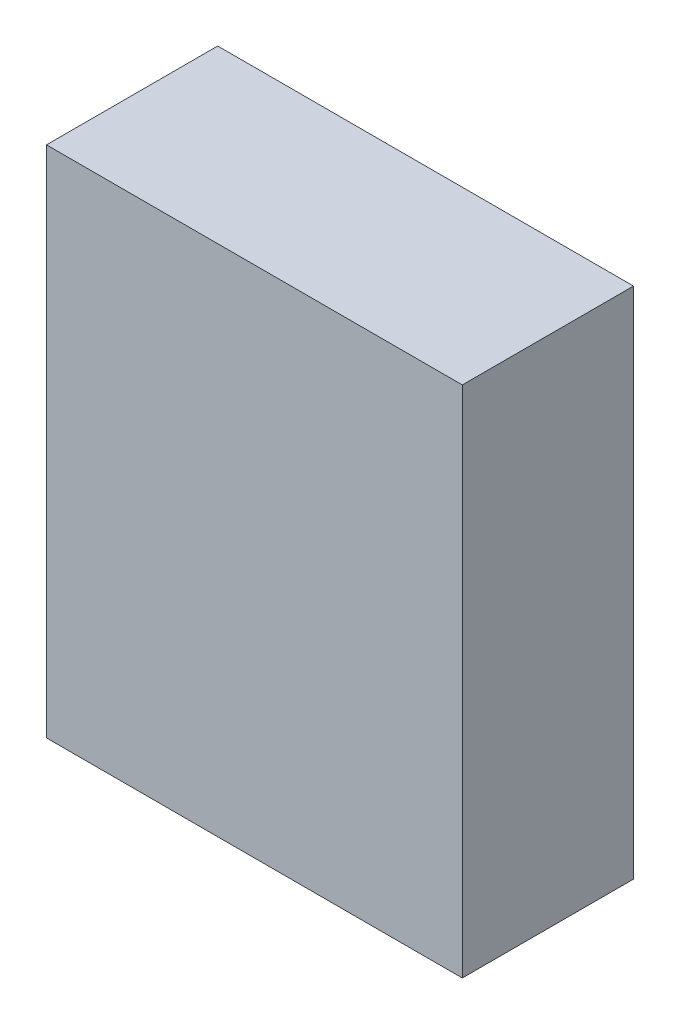
ISO-10303-21;
HEADER;
FILE_DESCRIPTION(('STEP AP214'),'2;1');
FILE_NAME('part.step','',(''),(''),'','','');
FILE_SCHEMA(('AUTOMOTIVE_DESIGN { 1 0 10303 214 1 1 1 1 }'));
ENDSEC;
DATA;
#1=APPLICATION_CONTEXT('core data for automotive mechanical design processes');
#2=APPLICATION_PROTOCOL_DEFINITION('international standard','automotive_design',2000,#1);
#3=PRODUCT_CONTEXT('',#1,'mechanical');
#4=PRODUCT('Part','Part','',(#3));
#5=PRODUCT_RELATED_PRODUCT_CATEGORY('part','',(#4));
#6=PRODUCT_DEFINITION_FORMATION('','',#4);
#7=PRODUCT_DEFINITION_CONTEXT('part definition',#1,'design');
#8=PRODUCT_DEFINITION('design','',#6,#7);
#9=PRODUCT_DEFINITION_SHAPE('','',#8);
#10=(LENGTH_UNIT() NAMED_UNIT(*) SI_UNIT(.MILLI.,.METRE.));
#11=(NAMED_UNIT(*) PLANE_ANGLE_UNIT() SI_UNIT($,.RADIAN.));
#12=(NAMED_UNIT(*) SI_UNIT($,.STERADIAN.) SOLID_ANGLE_UNIT());
#13=UNCERTAINTY_MEASURE_WITH_UNIT(LENGTH_MEASURE(1.E-05),#10,'distance_accuracy_value','');
#14=(GEOMETRIC_REPRESENTATION_CONTEXT(3) GLOBAL_UNCERTAINTY_ASSIGNED_CONTEXT((#13)) GLOBAL_UNIT_ASSIGNED_CONTEXT((#10,
#11,#12)) REPRESENTATION_CONTEXT('',''));
#15=CARTESIAN_POINT('',(0.,0.,0.));
#16=DIRECTION('',(0.,0.,1.));
#17=DIRECTION('',(1.,0.,0.));
#18=AXIS2_PLACEMENT_3D('',#15,#16,#17);
#19=CARTESIAN_POINT('',(22.0610671121381,2.95082692418756,2.82031719400001));
#20=CARTESIAN_POINT('',(22.0610671121381,2.95082692418756,1.98031582600001));
#21=CARTESIAN_POINT('',(22.0610671121381,0.430825868187557,2.82031719400001));
#22=CARTESIAN_POINT('',(22.0610671121381,0.430825868187557,1.98031582600001));
#23=(BOUNDED_SURFACE() B_SPLINE_SURFACE(1,1,((#19,#20),(#21,#22)),.UNSPECIFIED.,.F.,.F.,
.F.) B_SPLINE_SURFACE_WITH_KNOTS((2,2),(2,2),(-0.000210000088,0.002310000968),(-0.000770001254,
7.0000114E-05),.UNSPECIFIED.) GEOMETRIC_REPRESENTATION_ITEM() RATIONAL_B_SPLINE_SURFACE(((1.,
1.),(1.,1.))) REPRESENTATION_ITEM('') SURFACE());
#24=CARTESIAN_POINT('',(22.0610671121381,0.640825956187557,2.05031594000001));
#25=CARTESIAN_POINT('',(22.0610671121381,2.74082683618756,2.05031594000001));
#26=(BOUNDED_CURVE() B_SPLINE_CURVE(1,(#24,#25),.UNSPECIFIED.,.F.,
.F.) B_SPLINE_CURVE_WITH_KNOTS((2,2),(0.,0.00210000088),
.UNSPECIFIED.) CURVE() GEOMETRIC_REPRESENTATION_ITEM() RATIONAL_B_SPLINE_CURVE((1.,1.)) REPRESENTATION_ITEM(''));
#27=CARTESIAN_POINT('',(22.0610671121381,0.640825956187557,2.05031594000001));
#28=VERTEX_POINT('',#27);
#29=CARTESIAN_POINT('',(22.0610671121381,2.74082683618756,2.05031594000001));
#30=VERTEX_POINT('',#29);
#31=EDGE_CURVE('E109',#28,#30,#26,.T.);
#32=CARTESIAN_POINT('',(22.0610671121381,2.74082683618756,2.05031594000001));
#33=CARTESIAN_POINT('',(22.0610671121381,2.74082683618756,2.75031708000001));
#34=(BOUNDED_CURVE() B_SPLINE_CURVE(1,(#32,#33),.UNSPECIFIED.,.F.,
.F.) B_SPLINE_CURVE_WITH_KNOTS((2,2),(0.,0.00070000114),
.UNSPECIFIED.) CURVE() GEOMETRIC_REPRESENTATION_ITEM() RATIONAL_B_SPLINE_CURVE((1.,1.)) REPRESENTATION_ITEM(''));
#35=CARTESIAN_POINT('',(22.0610671121381,2.74082683618756,2.75031708000001));
#36=VERTEX_POINT('',#35);
#37=EDGE_CURVE('E11',#30,#36,#34,.T.);
#38=CARTESIAN_POINT('',(22.0610671121381,0.640825956187557,2.75031708000001));
#39=CARTESIAN_POINT('',(22.0610671121381,2.74082683618756,2.75031708000001));
#40=(BOUNDED_CURVE() B_SPLINE_CURVE(1,(#38,#39),.UNSPECIFIED.,.F.,
.F.) B_SPLINE_CURVE_WITH_KNOTS((2,2),(0.,0.00210000088),
.UNSPECIFIED.) CURVE() GEOMETRIC_REPRESENTATION_ITEM() RATIONAL_B_SPLINE_CURVE((1.,1.)) REPRESENTATION_ITEM(''));
#41=CARTESIAN_POINT('',(22.0610671121381,0.640825956187557,2.75031708000001));
#42=VERTEX_POINT('',#41);
#43=EDGE_CURVE('E89',#42,#36,#40,.T.);
#44=CARTESIAN_POINT('',(22.0610671121381,0.640825956187557,2.05031594000001));
#45=CARTESIAN_POINT('',(22.0610671121381,0.640825956187557,2.75031708000001));
#46=(BOUNDED_CURVE() B_SPLINE_CURVE(1,(#44,#45),.UNSPECIFIED.,.F.,
.F.) B_SPLINE_CURVE_WITH_KNOTS((2,2),(0.,0.00070000114),
.UNSPECIFIED.) CURVE() GEOMETRIC_REPRESENTATION_ITEM() RATIONAL_B_SPLINE_CURVE((1.,1.)) REPRESENTATION_ITEM(''));
#47=EDGE_CURVE('E71',#28,#42,#46,.T.);
#48=ORIENTED_EDGE('',*,*,#31,.T.);
#49=ORIENTED_EDGE('',*,*,#37,.T.);
#50=ORIENTED_EDGE('',*,*,#43,.F.);
#51=ORIENTED_EDGE('',*,*,#47,.F.);
#52=EDGE_LOOP('',(#48,#49,#50,#51));
#53=FACE_BOUND('',#52,.T.);
#54=ADVANCED_FACE('F17',(#53),#23,.T.);
#55=CARTESIAN_POINT('',(20.1910694544291,2.74082683618756,2.82031719400001));
#56=CARTESIAN_POINT('',(20.1910694544291,2.74082683618756,1.98031582600001));
#57=CARTESIAN_POINT('',(22.2310668992026,2.74082683618756,2.82031719400001));
#58=CARTESIAN_POINT('',(22.2310668992026,2.74082683618756,1.98031582600001));
#59=(BOUNDED_SURFACE() B_SPLINE_SURFACE(1,1,((#55,#56),(#57,#58)),.UNSPECIFIED.,.F.,.F.,
.F.) B_SPLINE_SURFACE_WITH_KNOTS((2,2),(2,2),(-0.00016999978706445,0.00186999765770895),
(-0.000770001254,7.0000114E-05),
.UNSPECIFIED.) GEOMETRIC_REPRESENTATION_ITEM() RATIONAL_B_SPLINE_SURFACE(((1.,1.),(1.,1.))) REPRESENTATION_ITEM('') SURFACE());
#60=CARTESIAN_POINT('',(22.0610671121381,2.74082683618756,2.05031594000001));
#61=CARTESIAN_POINT('',(20.3610692414936,2.74082683618756,2.05031594000001));
#62=(BOUNDED_CURVE() B_SPLINE_CURVE(1,(#60,#61),.UNSPECIFIED.,.F.,
.F.) B_SPLINE_CURVE_WITH_KNOTS((2,2),(0.,0.0016999978706445),
.UNSPECIFIED.) CURVE() GEOMETRIC_REPRESENTATION_ITEM() RATIONAL_B_SPLINE_CURVE((1.,1.)) REPRESENTATION_ITEM(''));
#63=CARTESIAN_POINT('',(20.3610692414936,2.74082683618756,2.05031594000001));
#64=VERTEX_POINT('',#63);
#65=EDGE_CURVE('E102',#30,#64,#62,.T.);
#66=CARTESIAN_POINT('',(20.3610692421381,2.74082683618756,2.05031594000001));
#67=CARTESIAN_POINT('',(20.3610692421381,2.74082683618756,2.75031708000001));
#68=(BOUNDED_CURVE() B_SPLINE_CURVE(1,(#66,#67),.UNSPECIFIED.,.F.,
.F.) B_SPLINE_CURVE_WITH_KNOTS((2,2),(0.,0.00070000114),
.UNSPECIFIED.) CURVE() GEOMETRIC_REPRESENTATION_ITEM() RATIONAL_B_SPLINE_CURVE((1.,1.)) REPRESENTATION_ITEM(''));
#69=CARTESIAN_POINT('',(20.3610692414936,2.74082683618756,2.75031708000001));
#70=VERTEX_POINT('',#69);
#71=EDGE_CURVE('E32',#64,#70,#68,.T.);
#72=CARTESIAN_POINT('',(22.0610671121381,2.74082683618756,2.75031708000001));
#73=CARTESIAN_POINT('',(20.3610692414936,2.74082683618756,2.75031708000001));
#74=(BOUNDED_CURVE() B_SPLINE_CURVE(1,(#72,#73),.UNSPECIFIED.,.F.,
.F.) B_SPLINE_CURVE_WITH_KNOTS((2,2),(0.,0.0016999978706445),
.UNSPECIFIED.) CURVE() GEOMETRIC_REPRESENTATION_ITEM() RATIONAL_B_SPLINE_CURVE((1.,1.)) REPRESENTATION_ITEM(''));
#75=EDGE_CURVE('E23',#36,#70,#74,.T.);
#76=ORIENTED_EDGE('',*,*,#65,.T.);
#77=ORIENTED_EDGE('',*,*,#71,.T.);
#78=ORIENTED_EDGE('',*,*,#75,.F.);
#79=ORIENTED_EDGE('',*,*,#37,.F.);
#80=EDGE_LOOP('',(#76,#77,#78,#79));
#81=FACE_BOUND('',#80,.T.);
#82=ADVANCED_FACE('F121',(#81),#59,.T.);
#83=CARTESIAN_POINT('',(20.3610692421381,0.430825868187557,2.82031719400001));
#84=CARTESIAN_POINT('',(20.3610692421381,0.430825868187557,1.98031582600001));
#85=CARTESIAN_POINT('',(20.3610692421381,2.95082692418756,2.82031719400001));
#86=CARTESIAN_POINT('',(20.3610692421381,2.95082692418756,1.98031582600001));
#87=(BOUNDED_SURFACE() B_SPLINE_SURFACE(1,1,((#83,#84),(#85,#86)),.UNSPECIFIED.,.F.,.F.,
.F.) B_SPLINE_SURFACE_WITH_KNOTS((2,2),(2,2),(-0.001260000528,0.001260000528),(-0.000420000684,
0.000420000684),.UNSPECIFIED.) GEOMETRIC_REPRESENTATION_ITEM() RATIONAL_B_SPLINE_SURFACE(((1.,
1.),(1.,1.))) REPRESENTATION_ITEM('') SURFACE());
#88=CARTESIAN_POINT('',(20.3610692421381,2.74082683618756,2.05031594000001));
#89=CARTESIAN_POINT('',(20.3610692421381,0.640825956187557,2.05031594000001));
#90=(BOUNDED_CURVE() B_SPLINE_CURVE(1,(#88,#89),.UNSPECIFIED.,.F.,
.F.) B_SPLINE_CURVE_WITH_KNOTS((2,2),(-0.00105000044,0.00105000044),
.UNSPECIFIED.) CURVE() GEOMETRIC_REPRESENTATION_ITEM() RATIONAL_B_SPLINE_CURVE((1.,1.)) REPRESENTATION_ITEM(''));
#91=CARTESIAN_POINT('',(20.3610692427826,0.640825956187557,2.05031594000001));
#92=VERTEX_POINT('',#91);
#93=EDGE_CURVE('E68',#64,#92,#90,.T.);
#94=CARTESIAN_POINT('',(20.3610692421381,0.640825956187557,2.05031594000001));
#95=CARTESIAN_POINT('',(20.3610692421381,0.640825956187557,2.75031708000001));
#96=(BOUNDED_CURVE() B_SPLINE_CURVE(1,(#94,#95),.UNSPECIFIED.,.F.,
.F.) B_SPLINE_CURVE_WITH_KNOTS((2,2),(-0.00035000057,0.00035000057),
.UNSPECIFIED.) CURVE() GEOMETRIC_REPRESENTATION_ITEM() RATIONAL_B_SPLINE_CURVE((1.,1.)) REPRESENTATION_ITEM(''));
#97=CARTESIAN_POINT('',(20.3610692427826,0.640825956187557,2.75031708000001));
#98=VERTEX_POINT('',#97);
#99=EDGE_CURVE('E58',#92,#98,#96,.T.);
#100=CARTESIAN_POINT('',(20.3610692421381,2.74082683618756,2.75031708000001));
#101=CARTESIAN_POINT('',(20.3610692421381,0.640825956187557,2.75031708000001));
#102=(BOUNDED_CURVE() B_SPLINE_CURVE(1,(#100,#101),.UNSPECIFIED.,.F.,
.F.) B_SPLINE_CURVE_WITH_KNOTS((2,2),(-0.00210000088,0.),
.UNSPECIFIED.) CURVE() GEOMETRIC_REPRESENTATION_ITEM() RATIONAL_B_SPLINE_CURVE((1.,1.)) REPRESENTATION_ITEM(''));
#103=EDGE_CURVE('E65',#70,#98,#102,.T.);
#104=ORIENTED_EDGE('',*,*,#93,.T.);
#105=ORIENTED_EDGE('',*,*,#99,.T.);
#106=ORIENTED_EDGE('',*,*,#103,.F.);
#107=ORIENTED_EDGE('',*,*,#71,.F.);
#108=EDGE_LOOP('',(#104,#105,#106,#107));
#109=FACE_BOUND('',#108,.T.);
#110=ADVANCED_FACE('F19',(#109),#87,.T.);
#111=CARTESIAN_POINT('',(22.2310668991381,0.640825956187557,2.82031719400001));
#112=CARTESIAN_POINT('',(22.2310668991381,0.640825956187557,1.98031582600001));
#113=CARTESIAN_POINT('',(20.1910694551381,0.640825956187557,2.82031719400001));
#114=CARTESIAN_POINT('',(20.1910694551381,0.640825956187557,1.98031582600001));
#115=(BOUNDED_SURFACE() B_SPLINE_SURFACE(1,1,((#111,#112),(#113,#114)),.UNSPECIFIED.,.F.,.F.,
.F.) B_SPLINE_SURFACE_WITH_KNOTS((2,2),(2,2),(-0.000170001057000001,0.001869996387),
(-0.000770001254,7.0000114E-05),
.UNSPECIFIED.) GEOMETRIC_REPRESENTATION_ITEM() RATIONAL_B_SPLINE_SURFACE(((1.,1.),(1.,1.))) REPRESENTATION_ITEM('') SURFACE());
#116=CARTESIAN_POINT('',(20.3610692427826,0.640825956187557,2.05031594000001));
#117=CARTESIAN_POINT('',(22.0610671121381,0.640825956187557,2.05031594000001));
#118=(BOUNDED_CURVE() B_SPLINE_CURVE(1,(#116,#117),.UNSPECIFIED.,.F.,
.F.) B_SPLINE_CURVE_WITH_KNOTS((2,2),(-1.26935550071039E-09,0.0016999966),
.UNSPECIFIED.) CURVE() GEOMETRIC_REPRESENTATION_ITEM() RATIONAL_B_SPLINE_CURVE((1.,1.)) REPRESENTATION_ITEM(''));
#119=EDGE_CURVE('E80',#92,#28,#118,.T.);
#120=CARTESIAN_POINT('',(20.3610692427826,0.640825956187557,2.75031708000001));
#121=CARTESIAN_POINT('',(22.0610671121381,0.640825956187557,2.75031708000001));
#122=(BOUNDED_CURVE() B_SPLINE_CURVE(1,(#120,#121),.UNSPECIFIED.,.F.,
.F.) B_SPLINE_CURVE_WITH_KNOTS((2,2),(-1.26935550071039E-09,0.0016999966),
.UNSPECIFIED.) CURVE() GEOMETRIC_REPRESENTATION_ITEM() RATIONAL_B_SPLINE_CURVE((1.,1.)) REPRESENTATION_ITEM(''));
#123=EDGE_CURVE('E74',#98,#42,#122,.T.);
#124=ORIENTED_EDGE('',*,*,#119,.T.);
#125=ORIENTED_EDGE('',*,*,#47,.T.);
#126=ORIENTED_EDGE('',*,*,#123,.F.);
#127=ORIENTED_EDGE('',*,*,#99,.F.);
#128=EDGE_LOOP('',(#124,#125,#126,#127));
#129=FACE_BOUND('',#128,.T.);
#130=ADVANCED_FACE('F75',(#129),#115,.T.);
#131=CARTESIAN_POINT('',(22.2310668992026,0.430825868187557,2.05031594000001));
#132=CARTESIAN_POINT('',(22.2310668992026,2.95082692418756,2.05031594000001));
#133=CARTESIAN_POINT('',(20.1910694544291,0.430825868187557,2.05031594000001));
#134=CARTESIAN_POINT('',(20.1910694544291,2.95082692418756,2.05031594000001));
#135=(BOUNDED_SURFACE() B_SPLINE_SURFACE(1,1,((#131,#132),(#133,#134)),.UNSPECIFIED.,.F.,.F.,
.F.) B_SPLINE_SURFACE_WITH_KNOTS((2,2),(2,2),(-0.00016999978706445,0.00186999765770895),
(-0.000210000088,0.002310000968),
.UNSPECIFIED.) GEOMETRIC_REPRESENTATION_ITEM() RATIONAL_B_SPLINE_SURFACE(((1.,1.),(1.,1.))) REPRESENTATION_ITEM('') SURFACE());
#136=ORIENTED_EDGE('',*,*,#119,.F.);
#137=ORIENTED_EDGE('',*,*,#93,.F.);
#138=ORIENTED_EDGE('',*,*,#65,.F.);
#139=ORIENTED_EDGE('',*,*,#31,.F.);
#140=EDGE_LOOP('',(#136,#137,#138,#139));
#141=FACE_BOUND('',#140,.T.);
#142=ADVANCED_FACE('F127',(#141),#135,.T.);
#143=CARTESIAN_POINT('',(20.1910694544291,0.430825868187557,2.75031708000001));
#144=CARTESIAN_POINT('',(20.1910694544291,2.95082692418756,2.75031708000001));
#145=CARTESIAN_POINT('',(22.2310668992026,0.430825868187557,2.75031708000001));
#146=CARTESIAN_POINT('',(22.2310668992026,2.95082692418756,2.75031708000001));
#147=(BOUNDED_SURFACE() B_SPLINE_SURFACE(1,1,((#143,#144),(#145,#146)),.UNSPECIFIED.,.F.,.F.,
.F.) B_SPLINE_SURFACE_WITH_KNOTS((2,2),(2,2),(-0.00016999978706445,0.00186999765770895),
(-0.000210000088,0.002310000968),
.UNSPECIFIED.) GEOMETRIC_REPRESENTATION_ITEM() RATIONAL_B_SPLINE_SURFACE(((1.,1.),(1.,1.))) REPRESENTATION_ITEM('') SURFACE());
#148=ORIENTED_EDGE('',*,*,#43,.T.);
#149=ORIENTED_EDGE('',*,*,#75,.T.);
#150=ORIENTED_EDGE('',*,*,#103,.T.);
#151=ORIENTED_EDGE('',*,*,#123,.T.);
#152=EDGE_LOOP('',(#148,#149,#150,#151));
#153=FACE_BOUND('',#152,.T.);
#154=ADVANCED_FACE('F82',(#153),#147,.T.);
#155=CLOSED_SHELL('',(#54,#82,#110,#130,#142,#154));
#156=MANIFOLD_SOLID_BREP('B1',#155);
#157=ADVANCED_BREP_SHAPE_REPRESENTATION('',(#18,#156),#14);
#158=SHAPE_DEFINITION_REPRESENTATION(#9,#157);
ENDSEC;
END-ISO-10303-21;
